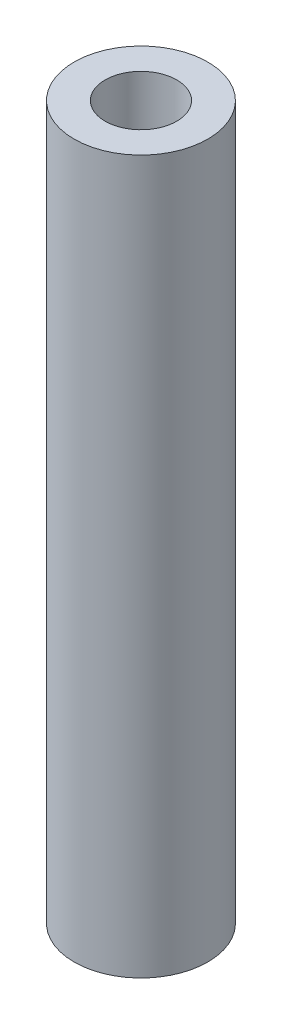
ISO-10303-21;
HEADER;
FILE_DESCRIPTION(('STEP AP214'),'2;1');
FILE_NAME('part.step','',(''),(''),'','','');
FILE_SCHEMA(('AUTOMOTIVE_DESIGN { 1 0 10303 214 1 1 1 1 }'));
ENDSEC;
DATA;
#1=APPLICATION_CONTEXT('core data for automotive mechanical design processes');
#2=APPLICATION_PROTOCOL_DEFINITION('international standard','automotive_design',2000,#1);
#3=PRODUCT_CONTEXT('',#1,'mechanical');
#4=PRODUCT('Part','Part','',(#3));
#5=PRODUCT_RELATED_PRODUCT_CATEGORY('part','',(#4));
#6=PRODUCT_DEFINITION_FORMATION('','',#4);
#7=PRODUCT_DEFINITION_CONTEXT('part definition',#1,'design');
#8=PRODUCT_DEFINITION('design','',#6,#7);
#9=PRODUCT_DEFINITION_SHAPE('','',#8);
#10=(LENGTH_UNIT() NAMED_UNIT(*) SI_UNIT(.MILLI.,.METRE.));
#11=(NAMED_UNIT(*) PLANE_ANGLE_UNIT() SI_UNIT($,.RADIAN.));
#12=(NAMED_UNIT(*) SI_UNIT($,.STERADIAN.) SOLID_ANGLE_UNIT());
#13=UNCERTAINTY_MEASURE_WITH_UNIT(LENGTH_MEASURE(1.E-05),#10,'distance_accuracy_value','');
#14=(GEOMETRIC_REPRESENTATION_CONTEXT(3) GLOBAL_UNCERTAINTY_ASSIGNED_CONTEXT((#13)) GLOBAL_UNIT_ASSIGNED_CONTEXT((#10,
#11,#12)) REPRESENTATION_CONTEXT('',''));
#15=CARTESIAN_POINT('',(0.,0.,0.));
#16=DIRECTION('',(0.,0.,1.));
#17=DIRECTION('',(1.,0.,0.));
#18=AXIS2_PLACEMENT_3D('',#15,#16,#17);
#19=CARTESIAN_POINT('',(0.,25.4,0.));
#20=DIRECTION('',(0.,1.,0.));
#21=DIRECTION('',(0.,0.,1.));
#22=AXIS2_PLACEMENT_3D('',#19,#20,#21);
#23=PLANE('',#22);
#24=CARTESIAN_POINT('',(0.,25.4,0.));
#25=DIRECTION('',(0.,1.,0.));
#26=DIRECTION('',(0.,0.,1.));
#27=AXIS2_PLACEMENT_3D('',#24,#25,#26);
#28=CIRCLE('',#27,4.7625);
#29=CARTESIAN_POINT('',(0.,25.4,4.7625));
#30=VERTEX_POINT('',#29);
#31=EDGE_CURVE('E10',#30,#30,#28,.T.);
#32=ORIENTED_EDGE('',*,*,#31,.T.);
#33=EDGE_LOOP('',(#32));
#34=FACE_BOUND('',#33,.T.);
#35=CARTESIAN_POINT('',(0.,25.4,0.));
#36=DIRECTION('',(0.,1.,0.));
#37=DIRECTION('',(0.,0.,1.));
#38=AXIS2_PLACEMENT_3D('',#35,#36,#37);
#39=CIRCLE('',#38,2.5527);
#40=CARTESIAN_POINT('',(0.,25.4,2.5527));
#41=VERTEX_POINT('',#40);
#42=EDGE_CURVE('E42',#41,#41,#39,.T.);
#43=ORIENTED_EDGE('',*,*,#42,.F.);
#44=EDGE_LOOP('',(#43));
#45=FACE_BOUND('',#44,.T.);
#46=ADVANCED_FACE('F31',(#34,#45),#23,.T.);
#47=CARTESIAN_POINT('',(0.,-25.4,0.));
#48=DIRECTION('',(0.,1.,0.));
#49=DIRECTION('',(0.,0.,1.));
#50=AXIS2_PLACEMENT_3D('',#47,#48,#49);
#51=PLANE('',#50);
#52=CARTESIAN_POINT('',(0.,-25.4,0.));
#53=DIRECTION('',(0.,1.,0.));
#54=DIRECTION('',(0.,0.,1.));
#55=AXIS2_PLACEMENT_3D('',#52,#53,#54);
#56=CIRCLE('',#55,4.7625);
#57=CARTESIAN_POINT('',(0.,-25.4,4.7625));
#58=VERTEX_POINT('',#57);
#59=EDGE_CURVE('E35',#58,#58,#56,.T.);
#60=ORIENTED_EDGE('',*,*,#59,.F.);
#61=EDGE_LOOP('',(#60));
#62=FACE_BOUND('',#61,.T.);
#63=CARTESIAN_POINT('',(0.,-25.4,0.));
#64=DIRECTION('',(0.,1.,0.));
#65=DIRECTION('',(0.,0.,1.));
#66=AXIS2_PLACEMENT_3D('',#63,#64,#65);
#67=CIRCLE('',#66,2.5527);
#68=CARTESIAN_POINT('',(0.,-25.4,2.5527));
#69=VERTEX_POINT('',#68);
#70=EDGE_CURVE('E44',#69,#69,#67,.T.);
#71=ORIENTED_EDGE('',*,*,#70,.T.);
#72=EDGE_LOOP('',(#71));
#73=FACE_BOUND('',#72,.T.);
#74=ADVANCED_FACE('F54',(#62,#73),#51,.F.);
#75=CARTESIAN_POINT('',(0.,25.4,0.));
#76=DIRECTION('',(0.,-1.,0.));
#77=DIRECTION('',(0.,0.,-1.));
#78=AXIS2_PLACEMENT_3D('',#75,#76,#77);
#79=CYLINDRICAL_SURFACE('',#78,4.7625);
#80=ORIENTED_EDGE('',*,*,#31,.F.);
#81=EDGE_LOOP('',(#80));
#82=FACE_BOUND('',#81,.T.);
#83=ORIENTED_EDGE('',*,*,#59,.T.);
#84=EDGE_LOOP('',(#83));
#85=FACE_BOUND('',#84,.T.);
#86=ADVANCED_FACE('F33',(#82,#85),#79,.T.);
#87=CARTESIAN_POINT('',(0.,25.4,0.));
#88=DIRECTION('',(0.,-1.,0.));
#89=DIRECTION('',(0.,0.,-1.));
#90=AXIS2_PLACEMENT_3D('',#87,#88,#89);
#91=CYLINDRICAL_SURFACE('',#90,2.5527);
#92=ORIENTED_EDGE('',*,*,#42,.T.);
#93=EDGE_LOOP('',(#92));
#94=FACE_BOUND('',#93,.T.);
#95=ORIENTED_EDGE('',*,*,#70,.F.);
#96=EDGE_LOOP('',(#95));
#97=FACE_BOUND('',#96,.T.);
#98=ADVANCED_FACE('F50',(#94,#97),#91,.F.);
#99=CLOSED_SHELL('',(#46,#74,#86,#98));
#100=MANIFOLD_SOLID_BREP('B2',#99);
#101=ADVANCED_BREP_SHAPE_REPRESENTATION('',(#18,#100),#14);
#102=SHAPE_DEFINITION_REPRESENTATION(#9,#101);
ENDSEC;
END-ISO-10303-21;
